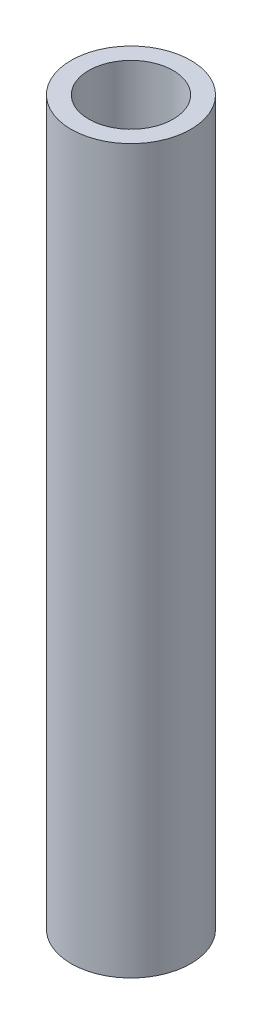
ISO-10303-21;
HEADER;
FILE_DESCRIPTION(('STEP AP214'),'2;1');
FILE_NAME('part.step','',(''),(''),'','','');
FILE_SCHEMA(('AUTOMOTIVE_DESIGN { 1 0 10303 214 1 1 1 1 }'));
ENDSEC;
DATA;
#1=APPLICATION_CONTEXT('core data for automotive mechanical design processes');
#2=APPLICATION_PROTOCOL_DEFINITION('international standard','automotive_design',2000,#1);
#3=PRODUCT_CONTEXT('',#1,'mechanical');
#4=PRODUCT('Part','Part','',(#3));
#5=PRODUCT_RELATED_PRODUCT_CATEGORY('part','',(#4));
#6=PRODUCT_DEFINITION_FORMATION('','',#4);
#7=PRODUCT_DEFINITION_CONTEXT('part definition',#1,'design');
#8=PRODUCT_DEFINITION('design','',#6,#7);
#9=PRODUCT_DEFINITION_SHAPE('','',#8);
#10=(LENGTH_UNIT() NAMED_UNIT(*) SI_UNIT(.MILLI.,.METRE.));
#11=(NAMED_UNIT(*) PLANE_ANGLE_UNIT() SI_UNIT($,.RADIAN.));
#12=(NAMED_UNIT(*) SI_UNIT($,.STERADIAN.) SOLID_ANGLE_UNIT());
#13=UNCERTAINTY_MEASURE_WITH_UNIT(LENGTH_MEASURE(1.E-05),#10,'distance_accuracy_value','');
#14=(GEOMETRIC_REPRESENTATION_CONTEXT(3) GLOBAL_UNCERTAINTY_ASSIGNED_CONTEXT((#13)) GLOBAL_UNIT_ASSIGNED_CONTEXT((#10,
#11,#12)) REPRESENTATION_CONTEXT('',''));
#15=CARTESIAN_POINT('',(0.,0.,0.));
#16=DIRECTION('',(0.,0.,1.));
#17=DIRECTION('',(1.,0.,0.));
#18=AXIS2_PLACEMENT_3D('',#15,#16,#17);
#19=CARTESIAN_POINT('',(0.,102.7,0.));
#20=DIRECTION('',(0.,1.,0.));
#21=DIRECTION('',(0.,0.,1.));
#22=AXIS2_PLACEMENT_3D('',#19,#20,#21);
#23=PLANE('',#22);
#24=CARTESIAN_POINT('',(0.,102.7,0.));
#25=DIRECTION('',(0.,1.,0.));
#26=DIRECTION('',(0.,0.,1.));
#27=AXIS2_PLACEMENT_3D('',#24,#25,#26);
#28=CIRCLE('',#27,8.5);
#29=CARTESIAN_POINT('',(0.,102.7,8.5));
#30=VERTEX_POINT('',#29);
#31=EDGE_CURVE('E10',#30,#30,#28,.T.);
#32=ORIENTED_EDGE('',*,*,#31,.T.);
#33=EDGE_LOOP('',(#32));
#34=FACE_BOUND('',#33,.T.);
#35=CARTESIAN_POINT('',(0.,102.7,0.));
#36=DIRECTION('',(0.,1.,0.));
#37=DIRECTION('',(0.,0.,1.));
#38=AXIS2_PLACEMENT_3D('',#35,#36,#37);
#39=CIRCLE('',#38,6.);
#40=CARTESIAN_POINT('',(0.,102.7,6.));
#41=VERTEX_POINT('',#40);
#42=EDGE_CURVE('E52',#41,#41,#39,.T.);
#43=ORIENTED_EDGE('',*,*,#42,.F.);
#44=EDGE_LOOP('',(#43));
#45=FACE_BOUND('',#44,.T.);
#46=ADVANCED_FACE('F39',(#34,#45),#23,.T.);
#47=CARTESIAN_POINT('',(0.,0.,0.));
#48=DIRECTION('',(0.,1.,0.));
#49=DIRECTION('',(0.,0.,1.));
#50=AXIS2_PLACEMENT_3D('',#47,#48,#49);
#51=PLANE('',#50);
#52=CARTESIAN_POINT('',(0.,0.,0.));
#53=DIRECTION('',(0.,1.,0.));
#54=DIRECTION('',(0.,0.,1.));
#55=AXIS2_PLACEMENT_3D('',#52,#53,#54);
#56=CIRCLE('',#55,8.5);
#57=CARTESIAN_POINT('',(0.,0.,8.5));
#58=VERTEX_POINT('',#57);
#59=EDGE_CURVE('E43',#58,#58,#56,.T.);
#60=ORIENTED_EDGE('',*,*,#59,.F.);
#61=EDGE_LOOP('',(#60));
#62=FACE_BOUND('',#61,.T.);
#63=CARTESIAN_POINT('',(0.,0.,0.));
#64=DIRECTION('',(0.,1.,0.));
#65=DIRECTION('',(0.,0.,1.));
#66=AXIS2_PLACEMENT_3D('',#63,#64,#65);
#67=CIRCLE('',#66,6.);
#68=CARTESIAN_POINT('',(0.,0.,6.));
#69=VERTEX_POINT('',#68);
#70=EDGE_CURVE('E54',#69,#69,#67,.T.);
#71=ORIENTED_EDGE('',*,*,#70,.T.);
#72=EDGE_LOOP('',(#71));
#73=FACE_BOUND('',#72,.T.);
#74=ADVANCED_FACE('F66',(#62,#73),#51,.F.);
#75=CARTESIAN_POINT('',(0.,102.7,0.));
#76=DIRECTION('',(0.,-1.,0.));
#77=DIRECTION('',(0.,0.,-1.));
#78=AXIS2_PLACEMENT_3D('',#75,#76,#77);
#79=CYLINDRICAL_SURFACE('',#78,8.5);
#80=ORIENTED_EDGE('',*,*,#31,.F.);
#81=EDGE_LOOP('',(#80));
#82=FACE_BOUND('',#81,.T.);
#83=ORIENTED_EDGE('',*,*,#59,.T.);
#84=EDGE_LOOP('',(#83));
#85=FACE_BOUND('',#84,.T.);
#86=ADVANCED_FACE('F41',(#82,#85),#79,.T.);
#87=CARTESIAN_POINT('',(0.,102.7,0.));
#88=DIRECTION('',(0.,-1.,0.));
#89=DIRECTION('',(0.,0.,-1.));
#90=AXIS2_PLACEMENT_3D('',#87,#88,#89);
#91=CYLINDRICAL_SURFACE('',#90,6.);
#92=ORIENTED_EDGE('',*,*,#42,.T.);
#93=EDGE_LOOP('',(#92));
#94=FACE_BOUND('',#93,.T.);
#95=ORIENTED_EDGE('',*,*,#70,.F.);
#96=EDGE_LOOP('',(#95));
#97=FACE_BOUND('',#96,.T.);
#98=ADVANCED_FACE('F62',(#94,#97),#91,.F.);
#99=CLOSED_SHELL('',(#46,#74,#86,#98));
#100=MANIFOLD_SOLID_BREP('B2',#99);
#101=ADVANCED_BREP_SHAPE_REPRESENTATION('',(#18,#100),#14);
#102=SHAPE_DEFINITION_REPRESENTATION(#9,#101);
ENDSEC;
END-ISO-10303-21;
